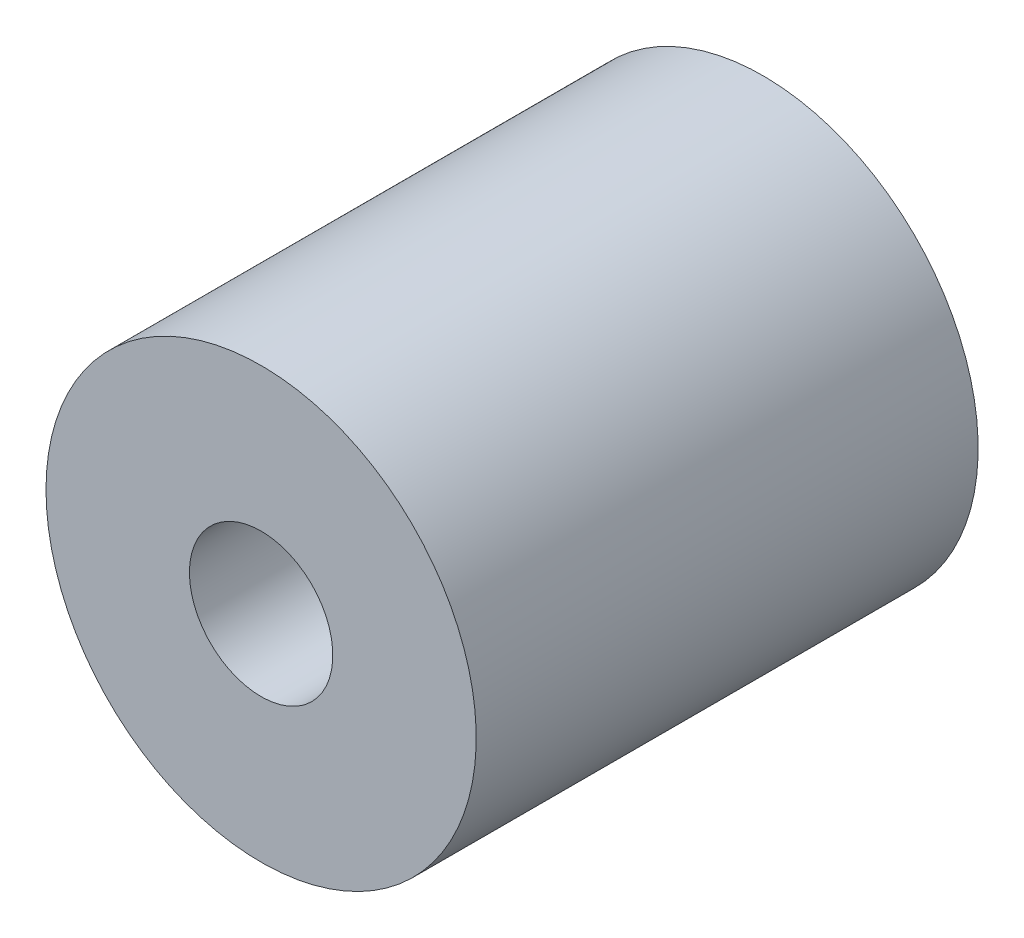
ISO-10303-21;
HEADER;
FILE_DESCRIPTION(('STEP AP214'),'2;1');
FILE_NAME('part.step','',(''),(''),'','','');
FILE_SCHEMA(('AUTOMOTIVE_DESIGN { 1 0 10303 214 1 1 1 1 }'));
ENDSEC;
DATA;
#1=APPLICATION_CONTEXT('core data for automotive mechanical design processes');
#2=APPLICATION_PROTOCOL_DEFINITION('international standard','automotive_design',2000,#1);
#3=PRODUCT_CONTEXT('',#1,'mechanical');
#4=PRODUCT('Part','Part','',(#3));
#5=PRODUCT_RELATED_PRODUCT_CATEGORY('part','',(#4));
#6=PRODUCT_DEFINITION_FORMATION('','',#4);
#7=PRODUCT_DEFINITION_CONTEXT('part definition',#1,'design');
#8=PRODUCT_DEFINITION('design','',#6,#7);
#9=PRODUCT_DEFINITION_SHAPE('','',#8);
#10=(LENGTH_UNIT() NAMED_UNIT(*) SI_UNIT(.MILLI.,.METRE.));
#11=(NAMED_UNIT(*) PLANE_ANGLE_UNIT() SI_UNIT($,.RADIAN.));
#12=(NAMED_UNIT(*) SI_UNIT($,.STERADIAN.) SOLID_ANGLE_UNIT());
#13=UNCERTAINTY_MEASURE_WITH_UNIT(LENGTH_MEASURE(1.E-05),#10,'distance_accuracy_value','');
#14=(GEOMETRIC_REPRESENTATION_CONTEXT(3) GLOBAL_UNCERTAINTY_ASSIGNED_CONTEXT((#13)) GLOBAL_UNIT_ASSIGNED_CONTEXT((#10,
#11,#12)) REPRESENTATION_CONTEXT('',''));
#15=CARTESIAN_POINT('',(0.,0.,0.));
#16=DIRECTION('',(0.,0.,1.));
#17=DIRECTION('',(1.,0.,0.));
#18=AXIS2_PLACEMENT_3D('',#15,#16,#17);
#19=CARTESIAN_POINT('',(0.,0.,0.));
#20=DIRECTION('',(0.,0.,-1.));
#21=DIRECTION('',(-1.,0.,0.));
#22=AXIS2_PLACEMENT_3D('',#19,#20,#21);
#23=CYLINDRICAL_SURFACE('',#22,2.);
#24=CARTESIAN_POINT('',(0.,0.,14.));
#25=DIRECTION('',(0.,0.,-1.));
#26=DIRECTION('',(-1.,0.,0.));
#27=AXIS2_PLACEMENT_3D('',#24,#25,#26);
#28=CIRCLE('',#27,2.);
#29=CARTESIAN_POINT('',(-2.,0.,14.));
#30=VERTEX_POINT('',#29);
#31=EDGE_CURVE('E10',#30,#30,#28,.T.);
#32=ORIENTED_EDGE('',*,*,#31,.F.);
#33=EDGE_LOOP('',(#32));
#34=FACE_BOUND('',#33,.T.);
#35=CARTESIAN_POINT('',(0.,0.,0.));
#36=DIRECTION('',(0.,0.,-1.));
#37=DIRECTION('',(-1.,0.,0.));
#38=AXIS2_PLACEMENT_3D('',#35,#36,#37);
#39=CIRCLE('',#38,2.);
#40=CARTESIAN_POINT('',(-2.,0.,0.));
#41=VERTEX_POINT('',#40);
#42=EDGE_CURVE('E54',#41,#41,#39,.T.);
#43=ORIENTED_EDGE('',*,*,#42,.T.);
#44=EDGE_LOOP('',(#43));
#45=FACE_BOUND('',#44,.T.);
#46=ADVANCED_FACE('F41',(#34,#45),#23,.F.);
#47=CARTESIAN_POINT('',(2.,0.,14.));
#48=DIRECTION('',(0.,0.,-1.));
#49=DIRECTION('',(-1.,0.,0.));
#50=AXIS2_PLACEMENT_3D('',#47,#48,#49);
#51=PLANE('',#50);
#52=CARTESIAN_POINT('',(0.,0.,14.));
#53=DIRECTION('',(0.,0.,-1.));
#54=DIRECTION('',(-1.,0.,0.));
#55=AXIS2_PLACEMENT_3D('',#52,#53,#54);
#56=CIRCLE('',#55,6.);
#57=CARTESIAN_POINT('',(-6.,0.,14.));
#58=VERTEX_POINT('',#57);
#59=EDGE_CURVE('E50',#58,#58,#56,.T.);
#60=ORIENTED_EDGE('',*,*,#59,.F.);
#61=EDGE_LOOP('',(#60));
#62=FACE_BOUND('',#61,.T.);
#63=ORIENTED_EDGE('',*,*,#31,.T.);
#64=EDGE_LOOP('',(#63));
#65=FACE_BOUND('',#64,.T.);
#66=ADVANCED_FACE('F66',(#62,#65),#51,.F.);
#67=CARTESIAN_POINT('',(0.,0.,0.));
#68=DIRECTION('',(0.,0.,-1.));
#69=DIRECTION('',(-1.,0.,0.));
#70=AXIS2_PLACEMENT_3D('',#67,#68,#69);
#71=CYLINDRICAL_SURFACE('',#70,6.);
#72=CARTESIAN_POINT('',(0.,0.,0.));
#73=DIRECTION('',(0.,0.,-1.));
#74=DIRECTION('',(-1.,0.,0.));
#75=AXIS2_PLACEMENT_3D('',#72,#73,#74);
#76=CIRCLE('',#75,6.);
#77=CARTESIAN_POINT('',(-6.,0.,0.));
#78=VERTEX_POINT('',#77);
#79=EDGE_CURVE('E51',#78,#78,#76,.T.);
#80=ORIENTED_EDGE('',*,*,#79,.F.);
#81=EDGE_LOOP('',(#80));
#82=FACE_BOUND('',#81,.T.);
#83=ORIENTED_EDGE('',*,*,#59,.T.);
#84=EDGE_LOOP('',(#83));
#85=FACE_BOUND('',#84,.T.);
#86=ADVANCED_FACE('F63',(#82,#85),#71,.T.);
#87=CARTESIAN_POINT('',(2.,0.,0.));
#88=DIRECTION('',(0.,0.,1.));
#89=DIRECTION('',(1.,0.,0.));
#90=AXIS2_PLACEMENT_3D('',#87,#88,#89);
#91=PLANE('',#90);
#92=ORIENTED_EDGE('',*,*,#42,.F.);
#93=EDGE_LOOP('',(#92));
#94=FACE_BOUND('',#93,.T.);
#95=ORIENTED_EDGE('',*,*,#79,.T.);
#96=EDGE_LOOP('',(#95));
#97=FACE_BOUND('',#96,.T.);
#98=ADVANCED_FACE('F65',(#94,#97),#91,.F.);
#99=CLOSED_SHELL('',(#46,#66,#86,#98));
#100=MANIFOLD_SOLID_BREP('B2',#99);
#101=ADVANCED_BREP_SHAPE_REPRESENTATION('',(#18,#100),#14);
#102=SHAPE_DEFINITION_REPRESENTATION(#9,#101);
ENDSEC;
END-ISO-10303-21;
